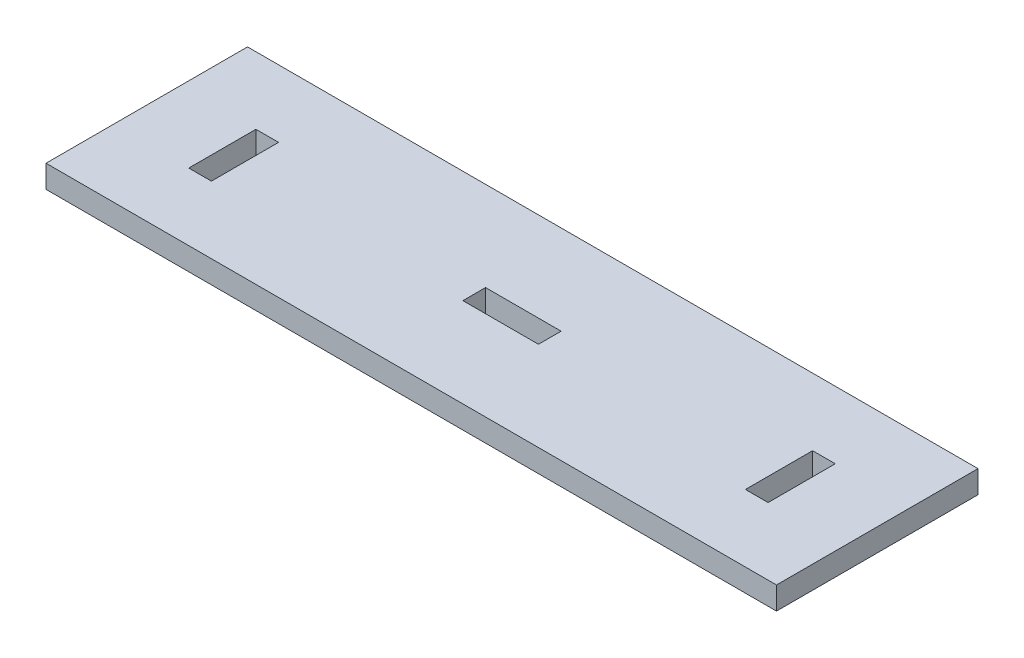
ISO-10303-21;
HEADER;
FILE_DESCRIPTION(('STEP AP214'),'2;1');
FILE_NAME('part.step','',(''),(''),'','','');
FILE_SCHEMA(('AUTOMOTIVE_DESIGN { 1 0 10303 214 1 1 1 1 }'));
ENDSEC;
DATA;
#1=APPLICATION_CONTEXT('core data for automotive mechanical design processes');
#2=APPLICATION_PROTOCOL_DEFINITION('international standard','automotive_design',2000,#1);
#3=PRODUCT_CONTEXT('',#1,'mechanical');
#4=PRODUCT('Part','Part','',(#3));
#5=PRODUCT_RELATED_PRODUCT_CATEGORY('part','',(#4));
#6=PRODUCT_DEFINITION_FORMATION('','',#4);
#7=PRODUCT_DEFINITION_CONTEXT('part definition',#1,'design');
#8=PRODUCT_DEFINITION('design','',#6,#7);
#9=PRODUCT_DEFINITION_SHAPE('','',#8);
#10=(LENGTH_UNIT() NAMED_UNIT(*) SI_UNIT(.MILLI.,.METRE.));
#11=(NAMED_UNIT(*) PLANE_ANGLE_UNIT() SI_UNIT($,.RADIAN.));
#12=(NAMED_UNIT(*) SI_UNIT($,.STERADIAN.) SOLID_ANGLE_UNIT());
#13=UNCERTAINTY_MEASURE_WITH_UNIT(LENGTH_MEASURE(1.E-05),#10,'distance_accuracy_value','');
#14=(GEOMETRIC_REPRESENTATION_CONTEXT(3) GLOBAL_UNCERTAINTY_ASSIGNED_CONTEXT((#13)) GLOBAL_UNIT_ASSIGNED_CONTEXT((#10,
#11,#12)) REPRESENTATION_CONTEXT('',''));
#15=CARTESIAN_POINT('',(0.,0.,0.));
#16=DIRECTION('',(0.,0.,1.));
#17=DIRECTION('',(1.,0.,0.));
#18=AXIS2_PLACEMENT_3D('',#15,#16,#17);
#19=CARTESIAN_POINT('',(0.,8.99999999999999,-44.5));
#20=DIRECTION('',(0.,0.,-1.));
#21=DIRECTION('',(-1.,0.,0.));
#22=AXIS2_PLACEMENT_3D('',#19,#20,#21);
#23=PLANE('',#22);
#24=DIRECTION('',(1.,0.,0.));
#25=VECTOR('',#24,1.);
#26=CARTESIAN_POINT('',(0.,0.,-44.5));
#27=LINE('',#26,#25);
#28=CARTESIAN_POINT('',(130.,0.,-44.5));
#29=VERTEX_POINT('',#28);
#30=CARTESIAN_POINT('',(160.,0.,-44.5));
#31=VERTEX_POINT('',#30);
#32=EDGE_CURVE('E239',#29,#31,#27,.T.);
#33=ORIENTED_EDGE('',*,*,#32,.T.);
#34=DIRECTION('',(0.,-1.,0.));
#35=VECTOR('',#34,1.);
#36=CARTESIAN_POINT('',(160.,8.99999999999999,-44.5));
#37=LINE('',#36,#35);
#38=CARTESIAN_POINT('',(160.,8.99999999999999,-44.5));
#39=VERTEX_POINT('',#38);
#40=EDGE_CURVE('E11',#39,#31,#37,.T.);
#41=ORIENTED_EDGE('',*,*,#40,.F.);
#42=DIRECTION('',(1.,0.,0.));
#43=VECTOR('',#42,1.);
#44=CARTESIAN_POINT('',(0.,8.99999999999999,-44.5));
#45=LINE('',#44,#43);
#46=CARTESIAN_POINT('',(130.,8.99999999999999,-44.5));
#47=VERTEX_POINT('',#46);
#48=EDGE_CURVE('E171',#47,#39,#45,.T.);
#49=ORIENTED_EDGE('',*,*,#48,.F.);
#50=DIRECTION('',(0.,-1.,0.));
#51=VECTOR('',#50,1.);
#52=CARTESIAN_POINT('',(130.,8.99999999999999,-44.5));
#53=LINE('',#52,#51);
#54=EDGE_CURVE('E62',#47,#29,#53,.T.);
#55=ORIENTED_EDGE('',*,*,#54,.T.);
#56=EDGE_LOOP('',(#33,#41,#49,#55));
#57=FACE_BOUND('',#56,.T.);
#58=ADVANCED_FACE('F42',(#57),#23,.F.);
#59=CARTESIAN_POINT('',(160.,8.99999999999999,0.));
#60=DIRECTION('',(1.,0.,0.));
#61=DIRECTION('',(0.,0.,-1.));
#62=AXIS2_PLACEMENT_3D('',#59,#60,#61);
#63=PLANE('',#62);
#64=DIRECTION('',(0.,0.,1.));
#65=VECTOR('',#64,1.);
#66=CARTESIAN_POINT('',(160.,0.,0.));
#67=LINE('',#66,#65);
#68=CARTESIAN_POINT('',(160.,0.,-35.5));
#69=VERTEX_POINT('',#68);
#70=EDGE_CURVE('E178',#31,#69,#67,.T.);
#71=ORIENTED_EDGE('',*,*,#70,.T.);
#72=DIRECTION('',(0.,-1.,0.));
#73=VECTOR('',#72,1.);
#74=CARTESIAN_POINT('',(160.,8.99999999999999,-35.5));
#75=LINE('',#74,#73);
#76=CARTESIAN_POINT('',(160.,8.99999999999999,-35.5));
#77=VERTEX_POINT('',#76);
#78=EDGE_CURVE('E53',#77,#69,#75,.T.);
#79=ORIENTED_EDGE('',*,*,#78,.F.);
#80=DIRECTION('',(0.,0.,1.));
#81=VECTOR('',#80,1.);
#82=CARTESIAN_POINT('',(160.,8.99999999999999,0.));
#83=LINE('',#82,#81);
#84=EDGE_CURVE('E165',#39,#77,#83,.T.);
#85=ORIENTED_EDGE('',*,*,#84,.F.);
#86=ORIENTED_EDGE('',*,*,#40,.T.);
#87=EDGE_LOOP('',(#71,#79,#85,#86));
#88=FACE_BOUND('',#87,.T.);
#89=ADVANCED_FACE('F177',(#88),#63,.F.);
#90=CARTESIAN_POINT('',(0.,8.99999999999999,-35.5));
#91=DIRECTION('',(0.,0.,-1.));
#92=DIRECTION('',(-1.,0.,0.));
#93=AXIS2_PLACEMENT_3D('',#90,#91,#92);
#94=PLANE('',#93);
#95=DIRECTION('',(1.,0.,0.));
#96=VECTOR('',#95,1.);
#97=CARTESIAN_POINT('',(0.,0.,-35.5));
#98=LINE('',#97,#96);
#99=CARTESIAN_POINT('',(130.,0.,-35.5));
#100=VERTEX_POINT('',#99);
#101=EDGE_CURVE('E244',#100,#69,#98,.T.);
#102=ORIENTED_EDGE('',*,*,#101,.F.);
#103=DIRECTION('',(0.,-1.,0.));
#104=VECTOR('',#103,1.);
#105=CARTESIAN_POINT('',(130.,8.99999999999999,-35.5));
#106=LINE('',#105,#104);
#107=CARTESIAN_POINT('',(130.,8.99999999999999,-35.5));
#108=VERTEX_POINT('',#107);
#109=EDGE_CURVE('E112',#108,#100,#106,.T.);
#110=ORIENTED_EDGE('',*,*,#109,.F.);
#111=DIRECTION('',(1.,0.,0.));
#112=VECTOR('',#111,1.);
#113=CARTESIAN_POINT('',(0.,8.99999999999999,-35.5));
#114=LINE('',#113,#112);
#115=EDGE_CURVE('E170',#108,#77,#114,.T.);
#116=ORIENTED_EDGE('',*,*,#115,.T.);
#117=ORIENTED_EDGE('',*,*,#78,.T.);
#118=EDGE_LOOP('',(#102,#110,#116,#117));
#119=FACE_BOUND('',#118,.T.);
#120=ADVANCED_FACE('F183',(#119),#94,.T.);
#121=CARTESIAN_POINT('',(0.,8.99999999999999,-26.6666666666667));
#122=DIRECTION('',(0.,0.,1.));
#123=DIRECTION('',(1.,0.,0.));
#124=AXIS2_PLACEMENT_3D('',#121,#122,#123);
#125=PLANE('',#124);
#126=DIRECTION('',(-1.,0.,0.));
#127=VECTOR('',#126,1.);
#128=CARTESIAN_POINT('',(0.,0.,-26.6666666666667));
#129=LINE('',#128,#127);
#130=CARTESIAN_POINT('',(39.,0.,-26.6666666666667));
#131=VERTEX_POINT('',#130);
#132=CARTESIAN_POINT('',(30.,0.,-26.6666666666667));
#133=VERTEX_POINT('',#132);
#134=EDGE_CURVE('E225',#131,#133,#129,.T.);
#135=ORIENTED_EDGE('',*,*,#134,.T.);
#136=DIRECTION('',(0.,-1.,0.));
#137=VECTOR('',#136,1.);
#138=CARTESIAN_POINT('',(30.,8.99999999999999,-26.6666666666667));
#139=LINE('',#138,#137);
#140=CARTESIAN_POINT('',(30.,8.99999999999999,-26.6666666666667));
#141=VERTEX_POINT('',#140);
#142=EDGE_CURVE('E254',#141,#133,#139,.T.);
#143=ORIENTED_EDGE('',*,*,#142,.F.);
#144=DIRECTION('',(-1.,0.,0.));
#145=VECTOR('',#144,1.);
#146=CARTESIAN_POINT('',(0.,8.99999999999999,-26.6666666666667));
#147=LINE('',#146,#145);
#148=CARTESIAN_POINT('',(39.,8.99999999999999,-26.6666666666667));
#149=VERTEX_POINT('',#148);
#150=EDGE_CURVE('E532',#149,#141,#147,.T.);
#151=ORIENTED_EDGE('',*,*,#150,.F.);
#152=DIRECTION('',(0.,-1.,0.));
#153=VECTOR('',#152,1.);
#154=CARTESIAN_POINT('',(39.,8.99999999999999,-26.6666666666667));
#155=LINE('',#154,#153);
#156=EDGE_CURVE('E257',#149,#131,#155,.T.);
#157=ORIENTED_EDGE('',*,*,#156,.T.);
#158=EDGE_LOOP('',(#135,#143,#151,#157));
#159=FACE_BOUND('',#158,.T.);
#160=ADVANCED_FACE('F337',(#159),#125,.F.);
#161=CARTESIAN_POINT('',(30.,8.99999999999999,0.));
#162=DIRECTION('',(1.,0.,0.));
#163=DIRECTION('',(0.,0.,-1.));
#164=AXIS2_PLACEMENT_3D('',#161,#162,#163);
#165=PLANE('',#164);
#166=DIRECTION('',(0.,0.,1.));
#167=VECTOR('',#166,1.);
#168=CARTESIAN_POINT('',(30.,0.,0.));
#169=LINE('',#168,#167);
#170=CARTESIAN_POINT('',(30.,0.,-53.3333333333333));
#171=VERTEX_POINT('',#170);
#172=EDGE_CURVE('E229',#171,#133,#169,.T.);
#173=ORIENTED_EDGE('',*,*,#172,.F.);
#174=DIRECTION('',(0.,-1.,0.));
#175=VECTOR('',#174,1.);
#176=CARTESIAN_POINT('',(30.,8.99999999999999,-53.3333333333333));
#177=LINE('',#176,#175);
#178=CARTESIAN_POINT('',(30.,8.99999999999999,-53.3333333333333));
#179=VERTEX_POINT('',#178);
#180=EDGE_CURVE('E266',#179,#171,#177,.T.);
#181=ORIENTED_EDGE('',*,*,#180,.F.);
#182=DIRECTION('',(0.,0.,1.));
#183=VECTOR('',#182,1.);
#184=CARTESIAN_POINT('',(30.,8.99999999999999,0.));
#185=LINE('',#184,#183);
#186=EDGE_CURVE('E528',#179,#141,#185,.T.);
#187=ORIENTED_EDGE('',*,*,#186,.T.);
#188=ORIENTED_EDGE('',*,*,#142,.T.);
#189=EDGE_LOOP('',(#173,#181,#187,#188));
#190=FACE_BOUND('',#189,.T.);
#191=ADVANCED_FACE('F333',(#190),#165,.T.);
#192=CARTESIAN_POINT('',(0.,8.99999999999999,-53.3333333333333));
#193=DIRECTION('',(0.,0.,-1.));
#194=DIRECTION('',(-1.,0.,0.));
#195=AXIS2_PLACEMENT_3D('',#192,#193,#194);
#196=PLANE('',#195);
#197=DIRECTION('',(1.,0.,0.));
#198=VECTOR('',#197,1.);
#199=CARTESIAN_POINT('',(0.,0.,-53.3333333333333));
#200=LINE('',#199,#198);
#201=CARTESIAN_POINT('',(39.,0.,-53.3333333333333));
#202=VERTEX_POINT('',#201);
#203=EDGE_CURVE('E233',#171,#202,#200,.T.);
#204=ORIENTED_EDGE('',*,*,#203,.T.);
#205=DIRECTION('',(0.,-1.,0.));
#206=VECTOR('',#205,1.);
#207=CARTESIAN_POINT('',(39.,8.99999999999999,-53.3333333333333));
#208=LINE('',#207,#206);
#209=CARTESIAN_POINT('',(39.,8.99999999999999,-53.3333333333333));
#210=VERTEX_POINT('',#209);
#211=EDGE_CURVE('E261',#210,#202,#208,.T.);
#212=ORIENTED_EDGE('',*,*,#211,.F.);
#213=DIRECTION('',(1.,0.,0.));
#214=VECTOR('',#213,1.);
#215=CARTESIAN_POINT('',(0.,8.99999999999999,-53.3333333333333));
#216=LINE('',#215,#214);
#217=EDGE_CURVE('E523',#179,#210,#216,.T.);
#218=ORIENTED_EDGE('',*,*,#217,.F.);
#219=ORIENTED_EDGE('',*,*,#180,.T.);
#220=EDGE_LOOP('',(#204,#212,#218,#219));
#221=FACE_BOUND('',#220,.T.);
#222=ADVANCED_FACE('F329',(#221),#196,.F.);
#223=CARTESIAN_POINT('',(260.,8.99999999999999,1.66533453693773E-13));
#224=DIRECTION('',(1.,0.,0.));
#225=DIRECTION('',(0.,0.,-1.));
#226=AXIS2_PLACEMENT_3D('',#223,#224,#225);
#227=PLANE('',#226);
#228=DIRECTION('',(0.,0.,1.));
#229=VECTOR('',#228,1.);
#230=CARTESIAN_POINT('',(260.,0.,1.66533453693773E-13));
#231=LINE('',#230,#229);
#232=CARTESIAN_POINT('',(260.,0.,-53.3333333333333));
#233=VERTEX_POINT('',#232);
#234=CARTESIAN_POINT('',(260.,0.,-26.6666666666667));
#235=VERTEX_POINT('',#234);
#236=EDGE_CURVE('E209',#233,#235,#231,.T.);
#237=ORIENTED_EDGE('',*,*,#236,.T.);
#238=DIRECTION('',(0.,-1.,0.));
#239=VECTOR('',#238,1.);
#240=CARTESIAN_POINT('',(260.,8.99999999999999,-26.6666666666667));
#241=LINE('',#240,#239);
#242=CARTESIAN_POINT('',(260.,8.99999999999999,-26.6666666666667));
#243=VERTEX_POINT('',#242);
#244=EDGE_CURVE('E262',#243,#235,#241,.T.);
#245=ORIENTED_EDGE('',*,*,#244,.F.);
#246=DIRECTION('',(0.,0.,1.));
#247=VECTOR('',#246,1.);
#248=CARTESIAN_POINT('',(260.,8.99999999999999,1.66533453693773E-13));
#249=LINE('',#248,#247);
#250=CARTESIAN_POINT('',(260.,8.99999999999999,-53.3333333333333));
#251=VERTEX_POINT('',#250);
#252=EDGE_CURVE('E547',#251,#243,#249,.T.);
#253=ORIENTED_EDGE('',*,*,#252,.F.);
#254=DIRECTION('',(0.,-1.,0.));
#255=VECTOR('',#254,1.);
#256=CARTESIAN_POINT('',(260.,8.99999999999999,-53.3333333333333));
#257=LINE('',#256,#255);
#258=EDGE_CURVE('E271',#251,#233,#257,.T.);
#259=ORIENTED_EDGE('',*,*,#258,.T.);
#260=EDGE_LOOP('',(#237,#245,#253,#259));
#261=FACE_BOUND('',#260,.T.);
#262=ADVANCED_FACE('F332',(#261),#227,.F.);
#263=CARTESIAN_POINT('',(0.,8.99999999999999,-26.6666666666667));
#264=DIRECTION('',(0.,0.,-1.));
#265=DIRECTION('',(-1.,0.,0.));
#266=AXIS2_PLACEMENT_3D('',#263,#264,#265);
#267=PLANE('',#266);
#268=DIRECTION('',(1.,0.,0.));
#269=VECTOR('',#268,1.);
#270=CARTESIAN_POINT('',(0.,0.,-26.6666666666667));
#271=LINE('',#270,#269);
#272=CARTESIAN_POINT('',(251.,0.,-26.6666666666667));
#273=VERTEX_POINT('',#272);
#274=EDGE_CURVE('E213',#273,#235,#271,.T.);
#275=ORIENTED_EDGE('',*,*,#274,.F.);
#276=DIRECTION('',(0.,-1.,0.));
#277=VECTOR('',#276,1.);
#278=CARTESIAN_POINT('',(251.,8.99999999999999,-26.6666666666667));
#279=LINE('',#278,#277);
#280=CARTESIAN_POINT('',(251.,8.99999999999999,-26.6666666666667));
#281=VERTEX_POINT('',#280);
#282=EDGE_CURVE('E277',#281,#273,#279,.T.);
#283=ORIENTED_EDGE('',*,*,#282,.F.);
#284=DIRECTION('',(1.,0.,0.));
#285=VECTOR('',#284,1.);
#286=CARTESIAN_POINT('',(0.,8.99999999999999,-26.6666666666667));
#287=LINE('',#286,#285);
#288=EDGE_CURVE('E543',#281,#243,#287,.T.);
#289=ORIENTED_EDGE('',*,*,#288,.T.);
#290=ORIENTED_EDGE('',*,*,#244,.T.);
#291=EDGE_LOOP('',(#275,#283,#289,#290));
#292=FACE_BOUND('',#291,.T.);
#293=ADVANCED_FACE('F348',(#292),#267,.T.);
#294=CARTESIAN_POINT('',(251.,8.99999999999999,-1.66533453693773E-13));
#295=DIRECTION('',(1.,0.,0.));
#296=DIRECTION('',(0.,0.,-1.));
#297=AXIS2_PLACEMENT_3D('',#294,#295,#296);
#298=PLANE('',#297);
#299=DIRECTION('',(0.,0.,1.));
#300=VECTOR('',#299,1.);
#301=CARTESIAN_POINT('',(251.,0.,-1.66533453693773E-13));
#302=LINE('',#301,#300);
#303=CARTESIAN_POINT('',(251.,0.,-53.3333333333333));
#304=VERTEX_POINT('',#303);
#305=EDGE_CURVE('E217',#304,#273,#302,.T.);
#306=ORIENTED_EDGE('',*,*,#305,.F.);
#307=DIRECTION('',(0.,-1.,0.));
#308=VECTOR('',#307,1.);
#309=CARTESIAN_POINT('',(251.,8.99999999999999,-53.3333333333333));
#310=LINE('',#309,#308);
#311=CARTESIAN_POINT('',(251.,8.99999999999999,-53.3333333333333));
#312=VERTEX_POINT('',#311);
#313=EDGE_CURVE('E274',#312,#304,#310,.T.);
#314=ORIENTED_EDGE('',*,*,#313,.F.);
#315=DIRECTION('',(0.,0.,1.));
#316=VECTOR('',#315,1.);
#317=CARTESIAN_POINT('',(251.,8.99999999999999,-1.66533453693773E-13));
#318=LINE('',#317,#316);
#319=EDGE_CURVE('E539',#312,#281,#318,.T.);
#320=ORIENTED_EDGE('',*,*,#319,.T.);
#321=ORIENTED_EDGE('',*,*,#282,.T.);
#322=EDGE_LOOP('',(#306,#314,#320,#321));
#323=FACE_BOUND('',#322,.T.);
#324=ADVANCED_FACE('F345',(#323),#298,.T.);
#325=CARTESIAN_POINT('',(0.,8.99999999999999,0.));
#326=DIRECTION('',(0.,0.,-1.));
#327=DIRECTION('',(-1.,0.,0.));
#328=AXIS2_PLACEMENT_3D('',#325,#326,#327);
#329=PLANE('',#328);
#330=DIRECTION('',(1.,0.,0.));
#331=VECTOR('',#330,1.);
#332=CARTESIAN_POINT('',(0.,0.,0.));
#333=LINE('',#332,#331);
#334=CARTESIAN_POINT('',(0.,0.,0.));
#335=VERTEX_POINT('',#334);
#336=CARTESIAN_POINT('',(290.,0.,0.));
#337=VERTEX_POINT('',#336);
#338=EDGE_CURVE('E193',#335,#337,#333,.T.);
#339=ORIENTED_EDGE('',*,*,#338,.T.);
#340=DIRECTION('',(0.,-1.,0.));
#341=VECTOR('',#340,1.);
#342=CARTESIAN_POINT('',(290.,8.99999999999999,0.));
#343=LINE('',#342,#341);
#344=CARTESIAN_POINT('',(290.,8.99999999999999,0.));
#345=VERTEX_POINT('',#344);
#346=EDGE_CURVE('E46',#345,#337,#343,.T.);
#347=ORIENTED_EDGE('',*,*,#346,.F.);
#348=DIRECTION('',(1.,0.,0.));
#349=VECTOR('',#348,1.);
#350=CARTESIAN_POINT('',(0.,8.99999999999999,0.));
#351=LINE('',#350,#349);
#352=CARTESIAN_POINT('',(0.,8.99999999999999,0.));
#353=VERTEX_POINT('',#352);
#354=EDGE_CURVE('E251',#353,#345,#351,.T.);
#355=ORIENTED_EDGE('',*,*,#354,.F.);
#356=DIRECTION('',(0.,-1.,0.));
#357=VECTOR('',#356,1.);
#358=CARTESIAN_POINT('',(0.,8.99999999999999,0.));
#359=LINE('',#358,#357);
#360=EDGE_CURVE('E189',#353,#335,#359,.T.);
#361=ORIENTED_EDGE('',*,*,#360,.T.);
#362=EDGE_LOOP('',(#339,#347,#355,#361));
#363=FACE_BOUND('',#362,.T.);
#364=ADVANCED_FACE('F44',(#363),#329,.F.);
#365=CARTESIAN_POINT('',(290.,8.99999999999999,0.));
#366=DIRECTION('',(-1.,0.,0.));
#367=DIRECTION('',(0.,0.,1.));
#368=AXIS2_PLACEMENT_3D('',#365,#366,#367);
#369=PLANE('',#368);
#370=DIRECTION('',(0.,0.,-1.));
#371=VECTOR('',#370,1.);
#372=CARTESIAN_POINT('',(290.,0.,0.));
#373=LINE('',#372,#371);
#374=CARTESIAN_POINT('',(290.,0.,-80.));
#375=VERTEX_POINT('',#374);
#376=EDGE_CURVE('E197',#337,#375,#373,.T.);
#377=ORIENTED_EDGE('',*,*,#376,.T.);
#378=DIRECTION('',(0.,-1.,0.));
#379=VECTOR('',#378,1.);
#380=CARTESIAN_POINT('',(290.,8.99999999999999,-80.));
#381=LINE('',#380,#379);
#382=CARTESIAN_POINT('',(290.,8.99999999999999,-80.));
#383=VERTEX_POINT('',#382);
#384=EDGE_CURVE('E286',#383,#375,#381,.T.);
#385=ORIENTED_EDGE('',*,*,#384,.F.);
#386=DIRECTION('',(0.,0.,-1.));
#387=VECTOR('',#386,1.);
#388=CARTESIAN_POINT('',(290.,8.99999999999999,0.));
#389=LINE('',#388,#387);
#390=EDGE_CURVE('E125',#345,#383,#389,.T.);
#391=ORIENTED_EDGE('',*,*,#390,.F.);
#392=ORIENTED_EDGE('',*,*,#346,.T.);
#393=EDGE_LOOP('',(#377,#385,#391,#392));
#394=FACE_BOUND('',#393,.T.);
#395=ADVANCED_FACE('F295',(#394),#369,.F.);
#396=CARTESIAN_POINT('',(0.,8.99999999999999,-80.));
#397=DIRECTION('',(0.,0.,-1.));
#398=DIRECTION('',(-1.,0.,0.));
#399=AXIS2_PLACEMENT_3D('',#396,#397,#398);
#400=PLANE('',#399);
#401=DIRECTION('',(1.,0.,0.));
#402=VECTOR('',#401,1.);
#403=CARTESIAN_POINT('',(0.,0.,-80.));
#404=LINE('',#403,#402);
#405=CARTESIAN_POINT('',(0.,0.,-80.));
#406=VERTEX_POINT('',#405);
#407=EDGE_CURVE('E201',#406,#375,#404,.T.);
#408=ORIENTED_EDGE('',*,*,#407,.F.);
#409=DIRECTION('',(0.,-1.,0.));
#410=VECTOR('',#409,1.);
#411=CARTESIAN_POINT('',(0.,8.99999999999999,-80.));
#412=LINE('',#411,#410);
#413=CARTESIAN_POINT('',(0.,8.99999999999999,-80.));
#414=VERTEX_POINT('',#413);
#415=EDGE_CURVE('E284',#414,#406,#412,.T.);
#416=ORIENTED_EDGE('',*,*,#415,.F.);
#417=DIRECTION('',(1.,0.,0.));
#418=VECTOR('',#417,1.);
#419=CARTESIAN_POINT('',(0.,8.99999999999999,-80.));
#420=LINE('',#419,#418);
#421=EDGE_CURVE('E552',#414,#383,#420,.T.);
#422=ORIENTED_EDGE('',*,*,#421,.T.);
#423=ORIENTED_EDGE('',*,*,#384,.T.);
#424=EDGE_LOOP('',(#408,#416,#422,#423));
#425=FACE_BOUND('',#424,.T.);
#426=ADVANCED_FACE('F309',(#425),#400,.T.);
#427=CARTESIAN_POINT('',(39.,8.99999999999999,0.));
#428=DIRECTION('',(1.,0.,0.));
#429=DIRECTION('',(0.,0.,-1.));
#430=AXIS2_PLACEMENT_3D('',#427,#428,#429);
#431=PLANE('',#430);
#432=DIRECTION('',(0.,0.,1.));
#433=VECTOR('',#432,1.);
#434=CARTESIAN_POINT('',(39.,0.,0.));
#435=LINE('',#434,#433);
#436=EDGE_CURVE('E236',#202,#131,#435,.T.);
#437=ORIENTED_EDGE('',*,*,#436,.T.);
#438=ORIENTED_EDGE('',*,*,#156,.F.);
#439=DIRECTION('',(0.,0.,1.));
#440=VECTOR('',#439,1.);
#441=CARTESIAN_POINT('',(39.,8.99999999999999,0.));
#442=LINE('',#441,#440);
#443=EDGE_CURVE('E520',#210,#149,#442,.T.);
#444=ORIENTED_EDGE('',*,*,#443,.F.);
#445=ORIENTED_EDGE('',*,*,#211,.T.);
#446=EDGE_LOOP('',(#437,#438,#444,#445));
#447=FACE_BOUND('',#446,.T.);
#448=ADVANCED_FACE('F311',(#447),#431,.F.);
#449=CARTESIAN_POINT('',(0.,8.99999999999999,-53.3333333333333));
#450=DIRECTION('',(0.,0.,1.));
#451=DIRECTION('',(1.,0.,0.));
#452=AXIS2_PLACEMENT_3D('',#449,#450,#451);
#453=PLANE('',#452);
#454=DIRECTION('',(-1.,0.,0.));
#455=VECTOR('',#454,1.);
#456=CARTESIAN_POINT('',(0.,0.,-53.3333333333333));
#457=LINE('',#456,#455);
#458=EDGE_CURVE('E221',#233,#304,#457,.T.);
#459=ORIENTED_EDGE('',*,*,#458,.F.);
#460=ORIENTED_EDGE('',*,*,#258,.F.);
#461=DIRECTION('',(-1.,0.,0.));
#462=VECTOR('',#461,1.);
#463=CARTESIAN_POINT('',(0.,8.99999999999999,-53.3333333333333));
#464=LINE('',#463,#462);
#465=EDGE_CURVE('E535',#251,#312,#464,.T.);
#466=ORIENTED_EDGE('',*,*,#465,.T.);
#467=ORIENTED_EDGE('',*,*,#313,.T.);
#468=EDGE_LOOP('',(#459,#460,#466,#467));
#469=FACE_BOUND('',#468,.T.);
#470=ADVANCED_FACE('F317',(#469),#453,.T.);
#471=CARTESIAN_POINT('',(0.,8.99999999999999,0.));
#472=DIRECTION('',(-1.,0.,0.));
#473=DIRECTION('',(0.,0.,1.));
#474=AXIS2_PLACEMENT_3D('',#471,#472,#473);
#475=PLANE('',#474);
#476=DIRECTION('',(0.,0.,-1.));
#477=VECTOR('',#476,1.);
#478=CARTESIAN_POINT('',(0.,0.,0.));
#479=LINE('',#478,#477);
#480=EDGE_CURVE('E205',#335,#406,#479,.T.);
#481=ORIENTED_EDGE('',*,*,#480,.F.);
#482=ORIENTED_EDGE('',*,*,#360,.F.);
#483=DIRECTION('',(0.,0.,-1.));
#484=VECTOR('',#483,1.);
#485=CARTESIAN_POINT('',(0.,8.99999999999999,0.));
#486=LINE('',#485,#484);
#487=EDGE_CURVE('E307',#353,#414,#486,.T.);
#488=ORIENTED_EDGE('',*,*,#487,.T.);
#489=ORIENTED_EDGE('',*,*,#415,.T.);
#490=EDGE_LOOP('',(#481,#482,#488,#489));
#491=FACE_BOUND('',#490,.T.);
#492=ADVANCED_FACE('F304',(#491),#475,.T.);
#493=CARTESIAN_POINT('',(130.,8.99999999999999,0.));
#494=DIRECTION('',(1.,0.,0.));
#495=DIRECTION('',(0.,0.,-1.));
#496=AXIS2_PLACEMENT_3D('',#493,#494,#495);
#497=PLANE('',#496);
#498=DIRECTION('',(0.,0.,1.));
#499=VECTOR('',#498,1.);
#500=CARTESIAN_POINT('',(130.,0.,0.));
#501=LINE('',#500,#499);
#502=EDGE_CURVE('E247',#29,#100,#501,.T.);
#503=ORIENTED_EDGE('',*,*,#502,.F.);
#504=ORIENTED_EDGE('',*,*,#54,.F.);
#505=DIRECTION('',(0.,0.,1.));
#506=VECTOR('',#505,1.);
#507=CARTESIAN_POINT('',(130.,8.99999999999999,0.));
#508=LINE('',#507,#506);
#509=EDGE_CURVE('E185',#47,#108,#508,.T.);
#510=ORIENTED_EDGE('',*,*,#509,.T.);
#511=ORIENTED_EDGE('',*,*,#109,.T.);
#512=EDGE_LOOP('',(#503,#504,#510,#511));
#513=FACE_BOUND('',#512,.T.);
#514=ADVANCED_FACE('F356',(#513),#497,.T.);
#515=CARTESIAN_POINT('',(0.,8.99999999999999,0.));
#516=DIRECTION('',(0.,1.,0.));
#517=DIRECTION('',(0.,0.,1.));
#518=AXIS2_PLACEMENT_3D('',#515,#516,#517);
#519=PLANE('',#518);
#520=ORIENTED_EDGE('',*,*,#354,.T.);
#521=ORIENTED_EDGE('',*,*,#390,.T.);
#522=ORIENTED_EDGE('',*,*,#421,.F.);
#523=ORIENTED_EDGE('',*,*,#487,.F.);
#524=EDGE_LOOP('',(#520,#521,#522,#523));
#525=FACE_BOUND('',#524,.T.);
#526=ORIENTED_EDGE('',*,*,#252,.T.);
#527=ORIENTED_EDGE('',*,*,#288,.F.);
#528=ORIENTED_EDGE('',*,*,#319,.F.);
#529=ORIENTED_EDGE('',*,*,#465,.F.);
#530=EDGE_LOOP('',(#526,#527,#528,#529));
#531=FACE_BOUND('',#530,.T.);
#532=ORIENTED_EDGE('',*,*,#150,.T.);
#533=ORIENTED_EDGE('',*,*,#186,.F.);
#534=ORIENTED_EDGE('',*,*,#217,.T.);
#535=ORIENTED_EDGE('',*,*,#443,.T.);
#536=EDGE_LOOP('',(#532,#533,#534,#535));
#537=FACE_BOUND('',#536,.T.);
#538=ORIENTED_EDGE('',*,*,#48,.T.);
#539=ORIENTED_EDGE('',*,*,#84,.T.);
#540=ORIENTED_EDGE('',*,*,#115,.F.);
#541=ORIENTED_EDGE('',*,*,#509,.F.);
#542=EDGE_LOOP('',(#538,#539,#540,#541));
#543=FACE_BOUND('',#542,.T.);
#544=ADVANCED_FACE('F167',(#525,#531,#537,#543),#519,.T.);
#545=CARTESIAN_POINT('',(0.,0.,0.));
#546=DIRECTION('',(0.,1.,0.));
#547=DIRECTION('',(0.,0.,1.));
#548=AXIS2_PLACEMENT_3D('',#545,#546,#547);
#549=PLANE('',#548);
#550=ORIENTED_EDGE('',*,*,#338,.F.);
#551=ORIENTED_EDGE('',*,*,#480,.T.);
#552=ORIENTED_EDGE('',*,*,#407,.T.);
#553=ORIENTED_EDGE('',*,*,#376,.F.);
#554=EDGE_LOOP('',(#550,#551,#552,#553));
#555=FACE_BOUND('',#554,.T.);
#556=ORIENTED_EDGE('',*,*,#236,.F.);
#557=ORIENTED_EDGE('',*,*,#458,.T.);
#558=ORIENTED_EDGE('',*,*,#305,.T.);
#559=ORIENTED_EDGE('',*,*,#274,.T.);
#560=EDGE_LOOP('',(#556,#557,#558,#559));
#561=FACE_BOUND('',#560,.T.);
#562=ORIENTED_EDGE('',*,*,#134,.F.);
#563=ORIENTED_EDGE('',*,*,#436,.F.);
#564=ORIENTED_EDGE('',*,*,#203,.F.);
#565=ORIENTED_EDGE('',*,*,#172,.T.);
#566=EDGE_LOOP('',(#562,#563,#564,#565));
#567=FACE_BOUND('',#566,.T.);
#568=ORIENTED_EDGE('',*,*,#32,.F.);
#569=ORIENTED_EDGE('',*,*,#502,.T.);
#570=ORIENTED_EDGE('',*,*,#101,.T.);
#571=ORIENTED_EDGE('',*,*,#70,.F.);
#572=EDGE_LOOP('',(#568,#569,#570,#571));
#573=FACE_BOUND('',#572,.T.);
#574=ADVANCED_FACE('F301',(#555,#561,#567,#573),#549,.F.);
#575=CLOSED_SHELL('',(#58,#89,#120,#160,#191,#222,#262,#293,#324,#364,#395,#426,#448,#470,#492,
#514,#544,#574));
#576=MANIFOLD_SOLID_BREP('B2',#575);
#577=ADVANCED_BREP_SHAPE_REPRESENTATION('',(#18,#576),#14);
#578=SHAPE_DEFINITION_REPRESENTATION(#9,#577);
ENDSEC;
END-ISO-10303-21;
